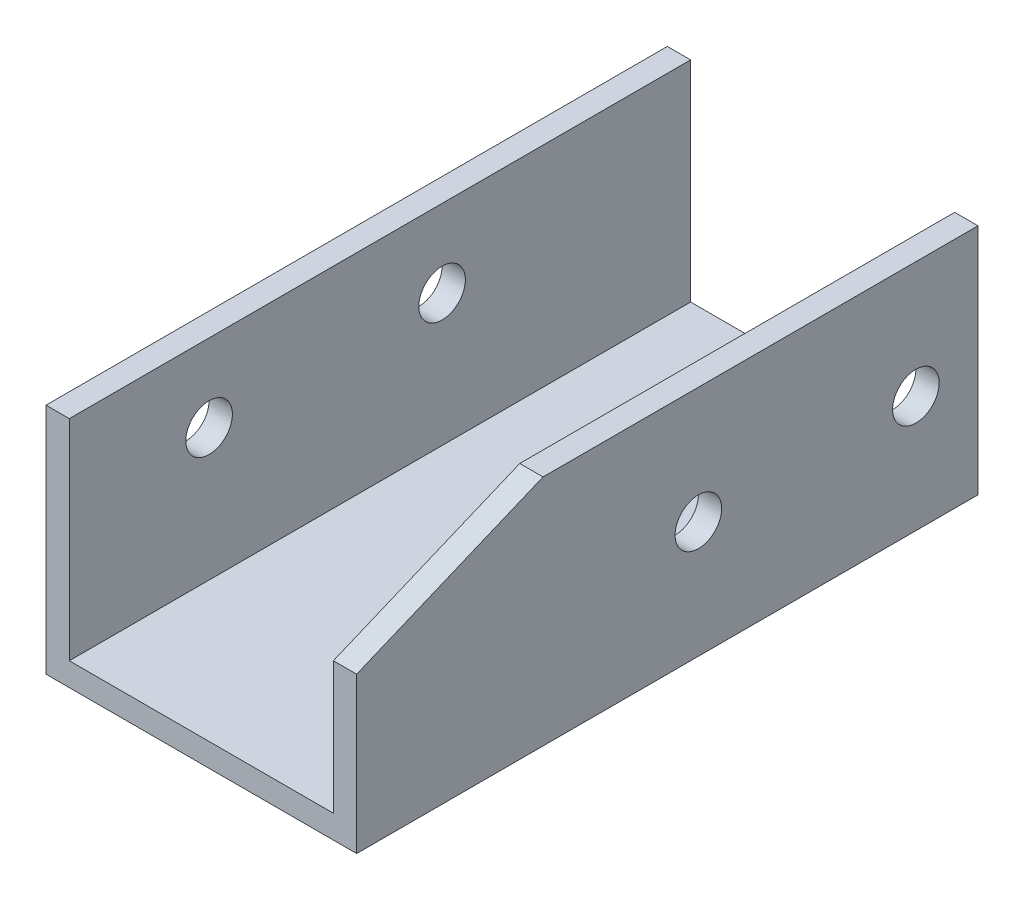
ISO-10303-21;
HEADER;
FILE_DESCRIPTION(('STEP AP214'),'2;1');
FILE_NAME('part.step','',(''),(''),'','','');
FILE_SCHEMA(('AUTOMOTIVE_DESIGN { 1 0 10303 214 1 1 1 1 }'));
ENDSEC;
DATA;
#1=APPLICATION_CONTEXT('core data for automotive mechanical design processes');
#2=APPLICATION_PROTOCOL_DEFINITION('international standard','automotive_design',2000,#1);
#3=PRODUCT_CONTEXT('',#1,'mechanical');
#4=PRODUCT('Part','Part','',(#3));
#5=PRODUCT_RELATED_PRODUCT_CATEGORY('part','',(#4));
#6=PRODUCT_DEFINITION_FORMATION('','',#4);
#7=PRODUCT_DEFINITION_CONTEXT('part definition',#1,'design');
#8=PRODUCT_DEFINITION('design','',#6,#7);
#9=PRODUCT_DEFINITION_SHAPE('','',#8);
#10=(LENGTH_UNIT() NAMED_UNIT(*) SI_UNIT(.MILLI.,.METRE.));
#11=(NAMED_UNIT(*) PLANE_ANGLE_UNIT() SI_UNIT($,.RADIAN.));
#12=(NAMED_UNIT(*) SI_UNIT($,.STERADIAN.) SOLID_ANGLE_UNIT());
#13=UNCERTAINTY_MEASURE_WITH_UNIT(LENGTH_MEASURE(1.E-05),#10,'distance_accuracy_value','');
#14=(GEOMETRIC_REPRESENTATION_CONTEXT(3) GLOBAL_UNCERTAINTY_ASSIGNED_CONTEXT((#13)) GLOBAL_UNIT_ASSIGNED_CONTEXT((#10,
#11,#12)) REPRESENTATION_CONTEXT('',''));
#15=CARTESIAN_POINT('',(0.,0.,0.));
#16=DIRECTION('',(0.,0.,1.));
#17=DIRECTION('',(1.,0.,0.));
#18=AXIS2_PLACEMENT_3D('',#15,#16,#17);
#19=CARTESIAN_POINT('',(-15.5907916429937,12.954,40.));
#20=DIRECTION('',(0.,-1.,0.));
#21=DIRECTION('',(0.,0.,-1.));
#22=AXIS2_PLACEMENT_3D('',#19,#20,#21);
#23=PLANE('',#22);
#24=DIRECTION('',(-1.,0.,0.));
#25=VECTOR('',#24,1.);
#26=CARTESIAN_POINT('',(-15.5907916429937,12.954,0.));
#27=LINE('',#26,#25);
#28=CARTESIAN_POINT('',(-15.5907916429937,12.954,0.));
#29=VERTEX_POINT('',#28);
#30=CARTESIAN_POINT('',(-17.0907916429937,12.954,0.));
#31=VERTEX_POINT('',#30);
#32=EDGE_CURVE('E132',#29,#31,#27,.T.);
#33=ORIENTED_EDGE('',*,*,#32,.T.);
#34=DIRECTION('',(0.,0.,-1.));
#35=VECTOR('',#34,1.);
#36=CARTESIAN_POINT('',(-17.0907916429937,12.954,40.));
#37=LINE('',#36,#35);
#38=CARTESIAN_POINT('',(-17.0907916429937,12.954,40.));
#39=VERTEX_POINT('',#38);
#40=EDGE_CURVE('E39',#39,#31,#37,.T.);
#41=ORIENTED_EDGE('',*,*,#40,.F.);
#42=DIRECTION('',(-1.,0.,0.));
#43=VECTOR('',#42,1.);
#44=CARTESIAN_POINT('',(-15.5907916429937,12.954,40.));
#45=LINE('',#44,#43);
#46=CARTESIAN_POINT('',(-15.5907916429937,12.954,40.));
#47=VERTEX_POINT('',#46);
#48=EDGE_CURVE('E150',#47,#39,#45,.T.);
#49=ORIENTED_EDGE('',*,*,#48,.F.);
#50=DIRECTION('',(0.,0.,-1.));
#51=VECTOR('',#50,1.);
#52=CARTESIAN_POINT('',(-15.5907916429937,12.954,40.));
#53=LINE('',#52,#51);
#54=EDGE_CURVE('E128',#47,#29,#53,.T.);
#55=ORIENTED_EDGE('',*,*,#54,.T.);
#56=EDGE_LOOP('',(#33,#41,#49,#55));
#57=FACE_BOUND('',#56,.T.);
#58=ADVANCED_FACE('F31',(#57),#23,.F.);
#59=CARTESIAN_POINT('',(-17.0907916429937,12.954,40.));
#60=DIRECTION('',(1.,0.,0.));
#61=DIRECTION('',(0.,1.,0.));
#62=AXIS2_PLACEMENT_3D('',#59,#60,#61);
#63=PLANE('',#62);
#64=CARTESIAN_POINT('',(-17.0907916429937,7.954,16.));
#65=DIRECTION('',(-1.,0.,0.));
#66=DIRECTION('',(0.,-1.,0.));
#67=AXIS2_PLACEMENT_3D('',#64,#65,#66);
#68=CIRCLE('',#67,1.5);
#69=CARTESIAN_POINT('',(-17.0907916429937,6.454,16.));
#70=VERTEX_POINT('',#69);
#71=EDGE_CURVE('E183',#70,#70,#68,.T.);
#72=ORIENTED_EDGE('',*,*,#71,.F.);
#73=EDGE_LOOP('',(#72));
#74=FACE_BOUND('',#73,.T.);
#75=CARTESIAN_POINT('',(-17.0907916429937,7.954,31.));
#76=DIRECTION('',(-1.,0.,0.));
#77=DIRECTION('',(0.,-1.,0.));
#78=AXIS2_PLACEMENT_3D('',#75,#76,#77);
#79=CIRCLE('',#78,1.5);
#80=CARTESIAN_POINT('',(-17.0907916429937,6.454,31.));
#81=VERTEX_POINT('',#80);
#82=EDGE_CURVE('E172',#81,#81,#79,.T.);
#83=ORIENTED_EDGE('',*,*,#82,.F.);
#84=EDGE_LOOP('',(#83));
#85=FACE_BOUND('',#84,.T.);
#86=DIRECTION('',(0.,-1.,0.));
#87=VECTOR('',#86,1.);
#88=CARTESIAN_POINT('',(-17.0907916429937,12.954,0.));
#89=LINE('',#88,#87);
#90=CARTESIAN_POINT('',(-17.0907916429937,-2.04599999999999,0.));
#91=VERTEX_POINT('',#90);
#92=EDGE_CURVE('E135',#31,#91,#89,.T.);
#93=ORIENTED_EDGE('',*,*,#92,.T.);
#94=DIRECTION('',(0.,0.,-1.));
#95=VECTOR('',#94,1.);
#96=CARTESIAN_POINT('',(-17.0907916429937,-2.04599999999999,40.));
#97=LINE('',#96,#95);
#98=CARTESIAN_POINT('',(-17.0907916429937,-2.04599999999999,40.));
#99=VERTEX_POINT('',#98);
#100=EDGE_CURVE('E159',#99,#91,#97,.T.);
#101=ORIENTED_EDGE('',*,*,#100,.F.);
#102=DIRECTION('',(0.,-1.,0.));
#103=VECTOR('',#102,1.);
#104=CARTESIAN_POINT('',(-17.0907916429937,12.954,40.));
#105=LINE('',#104,#103);
#106=EDGE_CURVE('E97',#39,#99,#105,.T.);
#107=ORIENTED_EDGE('',*,*,#106,.F.);
#108=ORIENTED_EDGE('',*,*,#40,.T.);
#109=EDGE_LOOP('',(#93,#101,#107,#108));
#110=FACE_BOUND('',#109,.T.);
#111=ADVANCED_FACE('F219',(#74,#85,#110),#63,.F.);
#112=CARTESIAN_POINT('',(-17.0907916429937,-2.04599999999999,40.));
#113=DIRECTION('',(0.,1.,0.));
#114=DIRECTION('',(0.,0.,1.));
#115=AXIS2_PLACEMENT_3D('',#112,#113,#114);
#116=PLANE('',#115);
#117=DIRECTION('',(1.,0.,0.));
#118=VECTOR('',#117,1.);
#119=CARTESIAN_POINT('',(-17.0907916429937,-2.04599999999999,0.));
#120=LINE('',#119,#118);
#121=CARTESIAN_POINT('',(2.90920835700635,-2.04599999999999,0.));
#122=VERTEX_POINT('',#121);
#123=EDGE_CURVE('E138',#91,#122,#120,.T.);
#124=ORIENTED_EDGE('',*,*,#123,.T.);
#125=DIRECTION('',(0.,0.,-1.));
#126=VECTOR('',#125,1.);
#127=CARTESIAN_POINT('',(2.90920835700635,-2.04599999999999,40.));
#128=LINE('',#127,#126);
#129=CARTESIAN_POINT('',(2.90920835700635,-2.04599999999999,40.));
#130=VERTEX_POINT('',#129);
#131=EDGE_CURVE('E156',#130,#122,#128,.T.);
#132=ORIENTED_EDGE('',*,*,#131,.F.);
#133=DIRECTION('',(1.,0.,0.));
#134=VECTOR('',#133,1.);
#135=CARTESIAN_POINT('',(-17.0907916429937,-2.04599999999999,40.));
#136=LINE('',#135,#134);
#137=EDGE_CURVE('E195',#99,#130,#136,.T.);
#138=ORIENTED_EDGE('',*,*,#137,.F.);
#139=ORIENTED_EDGE('',*,*,#100,.T.);
#140=EDGE_LOOP('',(#124,#132,#138,#139));
#141=FACE_BOUND('',#140,.T.);
#142=ADVANCED_FACE('F222',(#141),#116,.F.);
#143=CARTESIAN_POINT('',(2.90920835700635,-2.04599999999999,40.));
#144=DIRECTION('',(-1.,0.,0.));
#145=DIRECTION('',(0.,-1.,0.));
#146=AXIS2_PLACEMENT_3D('',#143,#144,#145);
#147=PLANE('',#146);
#148=CARTESIAN_POINT('',(2.90920835700635,5.45400000000001,4.));
#149=DIRECTION('',(1.,0.,0.));
#150=DIRECTION('',(0.,0.,-1.));
#151=AXIS2_PLACEMENT_3D('',#148,#149,#150);
#152=CIRCLE('',#151,1.5);
#153=CARTESIAN_POINT('',(2.90920835700635,5.45400000000001,2.5));
#154=VERTEX_POINT('',#153);
#155=EDGE_CURVE('E168',#154,#154,#152,.T.);
#156=ORIENTED_EDGE('',*,*,#155,.F.);
#157=EDGE_LOOP('',(#156));
#158=FACE_BOUND('',#157,.T.);
#159=CARTESIAN_POINT('',(2.90920835700635,5.45400000000001,18.));
#160=DIRECTION('',(1.,0.,0.));
#161=DIRECTION('',(0.,0.,-1.));
#162=AXIS2_PLACEMENT_3D('',#159,#160,#161);
#163=CIRCLE('',#162,1.5);
#164=CARTESIAN_POINT('',(2.90920835700635,5.45400000000001,16.5));
#165=VERTEX_POINT('',#164);
#166=EDGE_CURVE('E165',#165,#165,#163,.T.);
#167=ORIENTED_EDGE('',*,*,#166,.F.);
#168=EDGE_LOOP('',(#167));
#169=FACE_BOUND('',#168,.T.);
#170=DIRECTION('',(0.,0.,-1.));
#171=VECTOR('',#170,1.);
#172=CARTESIAN_POINT('',(2.90920835700636,12.954,40.));
#173=LINE('',#172,#171);
#174=CARTESIAN_POINT('',(2.90920835700635,12.954,28.));
#175=VERTEX_POINT('',#174);
#176=CARTESIAN_POINT('',(2.90920835700636,12.954,0.));
#177=VERTEX_POINT('',#176);
#178=EDGE_CURVE('E154',#175,#177,#173,.T.);
#179=ORIENTED_EDGE('',*,*,#178,.F.);
#180=DIRECTION('',(0.,0.384615384615385,-0.923076923076923));
#181=VECTOR('',#180,1.);
#182=CARTESIAN_POINT('',(2.90920835700635,12.954,28.));
#183=LINE('',#182,#181);
#184=CARTESIAN_POINT('',(2.90920835700635,7.95400000000001,40.));
#185=VERTEX_POINT('',#184);
#186=EDGE_CURVE('E171',#185,#175,#183,.T.);
#187=ORIENTED_EDGE('',*,*,#186,.F.);
#188=DIRECTION('',(0.,1.,0.));
#189=VECTOR('',#188,1.);
#190=CARTESIAN_POINT('',(2.90920835700635,-2.04599999999999,40.));
#191=LINE('',#190,#189);
#192=EDGE_CURVE('E114',#130,#185,#191,.T.);
#193=ORIENTED_EDGE('',*,*,#192,.F.);
#194=ORIENTED_EDGE('',*,*,#131,.T.);
#195=DIRECTION('',(0.,1.,0.));
#196=VECTOR('',#195,1.);
#197=CARTESIAN_POINT('',(2.90920835700635,-2.04599999999999,0.));
#198=LINE('',#197,#196);
#199=EDGE_CURVE('E140',#122,#177,#198,.T.);
#200=ORIENTED_EDGE('',*,*,#199,.T.);
#201=EDGE_LOOP('',(#179,#187,#193,#194,#200));
#202=FACE_BOUND('',#201,.T.);
#203=ADVANCED_FACE('F205',(#158,#169,#202),#147,.F.);
#204=CARTESIAN_POINT('',(2.90920835700636,12.954,40.));
#205=DIRECTION('',(0.,-1.,0.));
#206=DIRECTION('',(1.,0.,0.));
#207=AXIS2_PLACEMENT_3D('',#204,#205,#206);
#208=PLANE('',#207);
#209=DIRECTION('',(0.,0.,-1.));
#210=VECTOR('',#209,1.);
#211=CARTESIAN_POINT('',(1.40920835700636,12.954,40.));
#212=LINE('',#211,#210);
#213=CARTESIAN_POINT('',(1.40920835700636,12.954,28.));
#214=VERTEX_POINT('',#213);
#215=CARTESIAN_POINT('',(1.40920835700636,12.954,0.));
#216=VERTEX_POINT('',#215);
#217=EDGE_CURVE('E123',#214,#216,#212,.T.);
#218=ORIENTED_EDGE('',*,*,#217,.F.);
#219=DIRECTION('',(1.,0.,0.));
#220=VECTOR('',#219,1.);
#221=CARTESIAN_POINT('',(-7.09079164299365,12.954,28.));
#222=LINE('',#221,#220);
#223=EDGE_CURVE('E176',#214,#175,#222,.T.);
#224=ORIENTED_EDGE('',*,*,#223,.T.);
#225=ORIENTED_EDGE('',*,*,#178,.T.);
#226=DIRECTION('',(-1.,0.,0.));
#227=VECTOR('',#226,1.);
#228=CARTESIAN_POINT('',(2.90920835700636,12.954,0.));
#229=LINE('',#228,#227);
#230=EDGE_CURVE('E143',#177,#216,#229,.T.);
#231=ORIENTED_EDGE('',*,*,#230,.T.);
#232=EDGE_LOOP('',(#218,#224,#225,#231));
#233=FACE_BOUND('',#232,.T.);
#234=ADVANCED_FACE('F210',(#233),#208,.F.);
#235=CARTESIAN_POINT('',(1.40920835700636,12.954,40.));
#236=DIRECTION('',(1.,0.,0.));
#237=DIRECTION('',(0.,1.,0.));
#238=AXIS2_PLACEMENT_3D('',#235,#236,#237);
#239=PLANE('',#238);
#240=CARTESIAN_POINT('',(1.40920835700635,5.45400000000001,4.));
#241=DIRECTION('',(1.,0.,0.));
#242=DIRECTION('',(0.,1.,0.));
#243=AXIS2_PLACEMENT_3D('',#240,#241,#242);
#244=CIRCLE('',#243,1.5);
#245=CARTESIAN_POINT('',(1.40920835700635,6.95400000000001,4.));
#246=VERTEX_POINT('',#245);
#247=EDGE_CURVE('E166',#246,#246,#244,.T.);
#248=ORIENTED_EDGE('',*,*,#247,.T.);
#249=EDGE_LOOP('',(#248));
#250=FACE_BOUND('',#249,.T.);
#251=CARTESIAN_POINT('',(1.40920835700635,5.45400000000001,18.));
#252=DIRECTION('',(1.,0.,0.));
#253=DIRECTION('',(0.,1.,0.));
#254=AXIS2_PLACEMENT_3D('',#251,#252,#253);
#255=CIRCLE('',#254,1.5);
#256=CARTESIAN_POINT('',(1.40920835700635,6.95400000000001,18.));
#257=VERTEX_POINT('',#256);
#258=EDGE_CURVE('E136',#257,#257,#255,.T.);
#259=ORIENTED_EDGE('',*,*,#258,.T.);
#260=EDGE_LOOP('',(#259));
#261=FACE_BOUND('',#260,.T.);
#262=DIRECTION('',(0.,-1.,0.));
#263=VECTOR('',#262,1.);
#264=CARTESIAN_POINT('',(1.40920835700636,12.954,40.));
#265=LINE('',#264,#263);
#266=CARTESIAN_POINT('',(1.40920835700635,7.95400000000001,40.));
#267=VERTEX_POINT('',#266);
#268=CARTESIAN_POINT('',(1.40920835700635,-0.545999999999993,40.));
#269=VERTEX_POINT('',#268);
#270=EDGE_CURVE('E106',#267,#269,#265,.T.);
#271=ORIENTED_EDGE('',*,*,#270,.F.);
#272=DIRECTION('',(0.,0.384615384615385,-0.923076923076923));
#273=VECTOR('',#272,1.);
#274=CARTESIAN_POINT('',(1.40920835700635,8.69364497041421,38.2248520710059));
#275=LINE('',#274,#273);
#276=EDGE_CURVE('E46',#267,#214,#275,.T.);
#277=ORIENTED_EDGE('',*,*,#276,.T.);
#278=ORIENTED_EDGE('',*,*,#217,.T.);
#279=DIRECTION('',(0.,-1.,0.));
#280=VECTOR('',#279,1.);
#281=CARTESIAN_POINT('',(1.40920835700636,12.954,0.));
#282=LINE('',#281,#280);
#283=CARTESIAN_POINT('',(1.40920835700635,-0.545999999999993,0.));
#284=VERTEX_POINT('',#283);
#285=EDGE_CURVE('E120',#216,#284,#282,.T.);
#286=ORIENTED_EDGE('',*,*,#285,.T.);
#287=DIRECTION('',(0.,0.,-1.));
#288=VECTOR('',#287,1.);
#289=CARTESIAN_POINT('',(1.40920835700635,-0.545999999999993,40.));
#290=LINE('',#289,#288);
#291=EDGE_CURVE('E117',#269,#284,#290,.T.);
#292=ORIENTED_EDGE('',*,*,#291,.F.);
#293=EDGE_LOOP('',(#271,#277,#278,#286,#292));
#294=FACE_BOUND('',#293,.T.);
#295=ADVANCED_FACE('F118',(#250,#261,#294),#239,.F.);
#296=CARTESIAN_POINT('',(1.40920835700635,-0.545999999999993,40.));
#297=DIRECTION('',(0.,-1.,0.));
#298=DIRECTION('',(1.,0.,0.));
#299=AXIS2_PLACEMENT_3D('',#296,#297,#298);
#300=PLANE('',#299);
#301=DIRECTION('',(-1.,0.,0.));
#302=VECTOR('',#301,1.);
#303=CARTESIAN_POINT('',(1.40920835700635,-0.545999999999993,0.));
#304=LINE('',#303,#302);
#305=CARTESIAN_POINT('',(-15.5907916429937,-0.545999999999994,0.));
#306=VERTEX_POINT('',#305);
#307=EDGE_CURVE('E147',#284,#306,#304,.T.);
#308=ORIENTED_EDGE('',*,*,#307,.T.);
#309=DIRECTION('',(0.,0.,-1.));
#310=VECTOR('',#309,1.);
#311=CARTESIAN_POINT('',(-15.5907916429937,-0.545999999999994,40.));
#312=LINE('',#311,#310);
#313=CARTESIAN_POINT('',(-15.5907916429937,-0.545999999999994,40.));
#314=VERTEX_POINT('',#313);
#315=EDGE_CURVE('E124',#314,#306,#312,.T.);
#316=ORIENTED_EDGE('',*,*,#315,.F.);
#317=DIRECTION('',(-1.,0.,0.));
#318=VECTOR('',#317,1.);
#319=CARTESIAN_POINT('',(1.40920835700635,-0.545999999999993,40.));
#320=LINE('',#319,#318);
#321=EDGE_CURVE('E110',#269,#314,#320,.T.);
#322=ORIENTED_EDGE('',*,*,#321,.F.);
#323=ORIENTED_EDGE('',*,*,#291,.T.);
#324=EDGE_LOOP('',(#308,#316,#322,#323));
#325=FACE_BOUND('',#324,.T.);
#326=ADVANCED_FACE('F126',(#325),#300,.F.);
#327=CARTESIAN_POINT('',(-15.5907916429937,-0.545999999999994,40.));
#328=DIRECTION('',(-1.,0.,0.));
#329=DIRECTION('',(0.,-1.,0.));
#330=AXIS2_PLACEMENT_3D('',#327,#328,#329);
#331=PLANE('',#330);
#332=CARTESIAN_POINT('',(-15.5907916429937,7.954,16.));
#333=DIRECTION('',(-1.,0.,0.));
#334=DIRECTION('',(0.,-1.,0.));
#335=AXIS2_PLACEMENT_3D('',#332,#333,#334);
#336=CIRCLE('',#335,1.5);
#337=CARTESIAN_POINT('',(-15.5907916429937,6.454,16.));
#338=VERTEX_POINT('',#337);
#339=EDGE_CURVE('E34',#338,#338,#336,.T.);
#340=ORIENTED_EDGE('',*,*,#339,.T.);
#341=EDGE_LOOP('',(#340));
#342=FACE_BOUND('',#341,.T.);
#343=CARTESIAN_POINT('',(-15.5907916429937,7.954,31.));
#344=DIRECTION('',(-1.,0.,0.));
#345=DIRECTION('',(0.,-1.,0.));
#346=AXIS2_PLACEMENT_3D('',#343,#344,#345);
#347=CIRCLE('',#346,1.5);
#348=CARTESIAN_POINT('',(-15.5907916429937,6.454,31.));
#349=VERTEX_POINT('',#348);
#350=EDGE_CURVE('E169',#349,#349,#347,.T.);
#351=ORIENTED_EDGE('',*,*,#350,.T.);
#352=EDGE_LOOP('',(#351));
#353=FACE_BOUND('',#352,.T.);
#354=DIRECTION('',(0.,1.,0.));
#355=VECTOR('',#354,1.);
#356=CARTESIAN_POINT('',(-15.5907916429937,-0.545999999999994,0.));
#357=LINE('',#356,#355);
#358=EDGE_CURVE('E88',#306,#29,#357,.T.);
#359=ORIENTED_EDGE('',*,*,#358,.T.);
#360=ORIENTED_EDGE('',*,*,#54,.F.);
#361=DIRECTION('',(0.,1.,0.));
#362=VECTOR('',#361,1.);
#363=CARTESIAN_POINT('',(-15.5907916429937,-0.545999999999994,40.));
#364=LINE('',#363,#362);
#365=EDGE_CURVE('E55',#314,#47,#364,.T.);
#366=ORIENTED_EDGE('',*,*,#365,.F.);
#367=ORIENTED_EDGE('',*,*,#315,.T.);
#368=EDGE_LOOP('',(#359,#360,#366,#367));
#369=FACE_BOUND('',#368,.T.);
#370=ADVANCED_FACE('F215',(#342,#353,#369),#331,.F.);
#371=CARTESIAN_POINT('',(-17.0907916429937,12.954,40.));
#372=DIRECTION('',(0.,0.,1.));
#373=DIRECTION('',(1.,0.,0.));
#374=AXIS2_PLACEMENT_3D('',#371,#372,#373);
#375=PLANE('',#374);
#376=DIRECTION('',(1.,0.,0.));
#377=VECTOR('',#376,1.);
#378=CARTESIAN_POINT('',(-17.0907916429937,7.95400000000001,40.));
#379=LINE('',#378,#377);
#380=EDGE_CURVE('E11',#267,#185,#379,.T.);
#381=ORIENTED_EDGE('',*,*,#380,.F.);
#382=ORIENTED_EDGE('',*,*,#270,.T.);
#383=ORIENTED_EDGE('',*,*,#321,.T.);
#384=ORIENTED_EDGE('',*,*,#365,.T.);
#385=ORIENTED_EDGE('',*,*,#48,.T.);
#386=ORIENTED_EDGE('',*,*,#106,.T.);
#387=ORIENTED_EDGE('',*,*,#137,.T.);
#388=ORIENTED_EDGE('',*,*,#192,.T.);
#389=EDGE_LOOP('',(#381,#382,#383,#384,#385,#386,#387,#388));
#390=FACE_BOUND('',#389,.T.);
#391=ADVANCED_FACE('F108',(#390),#375,.T.);
#392=CARTESIAN_POINT('',(-17.0907916429937,12.954,0.));
#393=DIRECTION('',(0.,0.,1.));
#394=DIRECTION('',(1.,0.,0.));
#395=AXIS2_PLACEMENT_3D('',#392,#393,#394);
#396=PLANE('',#395);
#397=ORIENTED_EDGE('',*,*,#32,.F.);
#398=ORIENTED_EDGE('',*,*,#358,.F.);
#399=ORIENTED_EDGE('',*,*,#307,.F.);
#400=ORIENTED_EDGE('',*,*,#285,.F.);
#401=ORIENTED_EDGE('',*,*,#230,.F.);
#402=ORIENTED_EDGE('',*,*,#199,.F.);
#403=ORIENTED_EDGE('',*,*,#123,.F.);
#404=ORIENTED_EDGE('',*,*,#92,.F.);
#405=EDGE_LOOP('',(#397,#398,#399,#400,#401,#402,#403,#404));
#406=FACE_BOUND('',#405,.T.);
#407=ADVANCED_FACE('F214',(#406),#396,.F.);
#408=CARTESIAN_POINT('',(-7.09079164299365,5.45400000000001,18.));
#409=DIRECTION('',(1.,0.,0.));
#410=DIRECTION('',(0.,0.,-1.));
#411=AXIS2_PLACEMENT_3D('',#408,#409,#410);
#412=CYLINDRICAL_SURFACE('',#411,1.5);
#413=ORIENTED_EDGE('',*,*,#166,.T.);
#414=EDGE_LOOP('',(#413));
#415=FACE_BOUND('',#414,.T.);
#416=ORIENTED_EDGE('',*,*,#258,.F.);
#417=EDGE_LOOP('',(#416));
#418=FACE_BOUND('',#417,.T.);
#419=ADVANCED_FACE('F288',(#415,#418),#412,.F.);
#420=CARTESIAN_POINT('',(-7.09079164299365,5.45400000000001,4.));
#421=DIRECTION('',(1.,0.,0.));
#422=DIRECTION('',(0.,0.,-1.));
#423=AXIS2_PLACEMENT_3D('',#420,#421,#422);
#424=CYLINDRICAL_SURFACE('',#423,1.5);
#425=ORIENTED_EDGE('',*,*,#155,.T.);
#426=EDGE_LOOP('',(#425));
#427=FACE_BOUND('',#426,.T.);
#428=ORIENTED_EDGE('',*,*,#247,.F.);
#429=EDGE_LOOP('',(#428));
#430=FACE_BOUND('',#429,.T.);
#431=ADVANCED_FACE('F285',(#427,#430),#424,.F.);
#432=CARTESIAN_POINT('',(-7.09079164299365,12.954,28.));
#433=DIRECTION('',(0.,-0.923076923076923,-0.384615384615385));
#434=DIRECTION('',(0.,0.384615384615385,-0.923076923076923));
#435=AXIS2_PLACEMENT_3D('',#432,#433,#434);
#436=PLANE('',#435);
#437=ORIENTED_EDGE('',*,*,#380,.T.);
#438=ORIENTED_EDGE('',*,*,#186,.T.);
#439=ORIENTED_EDGE('',*,*,#223,.F.);
#440=ORIENTED_EDGE('',*,*,#276,.F.);
#441=EDGE_LOOP('',(#437,#438,#439,#440));
#442=FACE_BOUND('',#441,.T.);
#443=ADVANCED_FACE('F207',(#442),#436,.F.);
#444=CARTESIAN_POINT('',(-7.09079164299365,7.95400000000001,31.));
#445=DIRECTION('',(-1.,0.,0.));
#446=DIRECTION('',(0.,-1.,0.));
#447=AXIS2_PLACEMENT_3D('',#444,#445,#446);
#448=CYLINDRICAL_SURFACE('',#447,1.5);
#449=ORIENTED_EDGE('',*,*,#82,.T.);
#450=EDGE_LOOP('',(#449));
#451=FACE_BOUND('',#450,.T.);
#452=ORIENTED_EDGE('',*,*,#350,.F.);
#453=EDGE_LOOP('',(#452));
#454=FACE_BOUND('',#453,.T.);
#455=ADVANCED_FACE('F263',(#451,#454),#448,.F.);
#456=CARTESIAN_POINT('',(-7.09079164299365,7.95400000000001,16.));
#457=DIRECTION('',(-1.,0.,0.));
#458=DIRECTION('',(0.,-1.,0.));
#459=AXIS2_PLACEMENT_3D('',#456,#457,#458);
#460=CYLINDRICAL_SURFACE('',#459,1.5);
#461=ORIENTED_EDGE('',*,*,#71,.T.);
#462=EDGE_LOOP('',(#461));
#463=FACE_BOUND('',#462,.T.);
#464=ORIENTED_EDGE('',*,*,#339,.F.);
#465=EDGE_LOOP('',(#464));
#466=FACE_BOUND('',#465,.T.);
#467=ADVANCED_FACE('F268',(#463,#466),#460,.F.);
#468=CLOSED_SHELL('',(#58,#111,#142,#203,#234,#295,#326,#370,#391,#407,#419,#431,#443,#455,#467));
#469=MANIFOLD_SOLID_BREP('B2',#468);
#470=ADVANCED_BREP_SHAPE_REPRESENTATION('',(#18,#469),#14);
#471=SHAPE_DEFINITION_REPRESENTATION(#9,#470);
ENDSEC;
END-ISO-10303-21;
